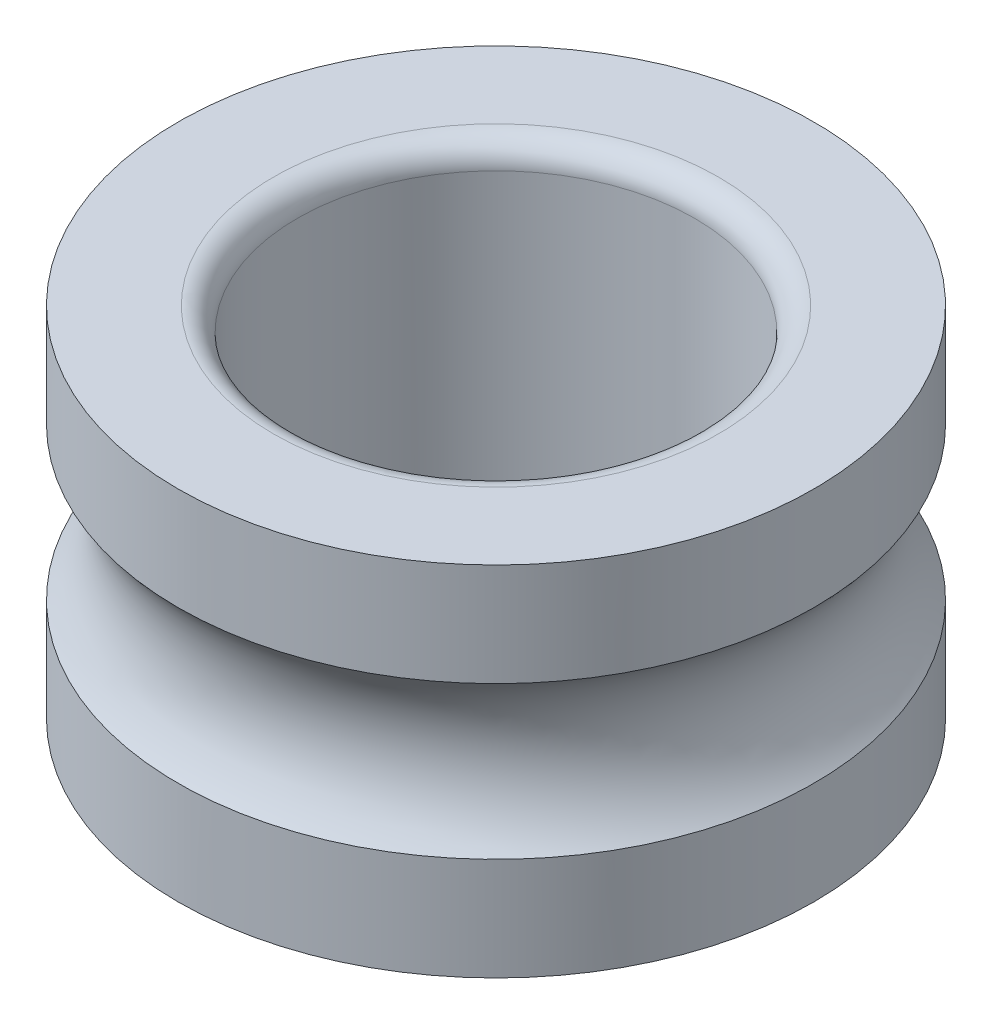
ISO-10303-21;
HEADER;
FILE_DESCRIPTION(('STEP AP214'),'2;1');
FILE_NAME('part.step','',(''),(''),'','','');
FILE_SCHEMA(('AUTOMOTIVE_DESIGN { 1 0 10303 214 1 1 1 1 }'));
ENDSEC;
DATA;
#1=APPLICATION_CONTEXT('core data for automotive mechanical design processes');
#2=APPLICATION_PROTOCOL_DEFINITION('international standard','automotive_design',2000,#1);
#3=PRODUCT_CONTEXT('',#1,'mechanical');
#4=PRODUCT('Part','Part','',(#3));
#5=PRODUCT_RELATED_PRODUCT_CATEGORY('part','',(#4));
#6=PRODUCT_DEFINITION_FORMATION('','',#4);
#7=PRODUCT_DEFINITION_CONTEXT('part definition',#1,'design');
#8=PRODUCT_DEFINITION('design','',#6,#7);
#9=PRODUCT_DEFINITION_SHAPE('','',#8);
#10=(LENGTH_UNIT() NAMED_UNIT(*) SI_UNIT(.MILLI.,.METRE.));
#11=(NAMED_UNIT(*) PLANE_ANGLE_UNIT() SI_UNIT($,.RADIAN.));
#12=(NAMED_UNIT(*) SI_UNIT($,.STERADIAN.) SOLID_ANGLE_UNIT());
#13=UNCERTAINTY_MEASURE_WITH_UNIT(LENGTH_MEASURE(1.E-05),#10,'distance_accuracy_value','');
#14=(GEOMETRIC_REPRESENTATION_CONTEXT(3) GLOBAL_UNCERTAINTY_ASSIGNED_CONTEXT((#13)) GLOBAL_UNIT_ASSIGNED_CONTEXT((#10,
#11,#12)) REPRESENTATION_CONTEXT('',''));
#15=CARTESIAN_POINT('',(0.,0.,0.));
#16=DIRECTION('',(0.,0.,1.));
#17=DIRECTION('',(1.,0.,0.));
#18=AXIS2_PLACEMENT_3D('',#15,#16,#17);
#19=CARTESIAN_POINT('',(0.,-3.9,0.));
#20=DIRECTION('',(0.,1.,0.));
#21=DIRECTION('',(0.,0.,-1.));
#22=AXIS2_PLACEMENT_3D('',#19,#20,#21);
#23=TOROIDAL_SURFACE('',#22,5.6,0.6);
#24=CARTESIAN_POINT('',(0.,-3.9,0.));
#25=DIRECTION('',(0.,-1.,0.));
#26=DIRECTION('',(0.,0.,-1.));
#27=AXIS2_PLACEMENT_3D('',#24,#25,#26);
#28=CIRCLE('',#27,5.);
#29=CARTESIAN_POINT('',(0.,-3.9,5.));
#30=VERTEX_POINT('',#29);
#31=EDGE_CURVE('E11',#30,#30,#28,.T.);
#32=ORIENTED_EDGE('',*,*,#31,.F.);
#33=EDGE_LOOP('',(#32));
#34=FACE_BOUND('',#33,.T.);
#35=CARTESIAN_POINT('',(0.,-4.5,0.));
#36=DIRECTION('',(0.,1.,0.));
#37=DIRECTION('',(0.,0.,-1.));
#38=AXIS2_PLACEMENT_3D('',#35,#36,#37);
#39=CIRCLE('',#38,5.6);
#40=CARTESIAN_POINT('',(0.,-4.5,-5.6));
#41=VERTEX_POINT('',#40);
#42=EDGE_CURVE('E46',#41,#41,#39,.T.);
#43=ORIENTED_EDGE('',*,*,#42,.F.);
#44=EDGE_LOOP('',(#43));
#45=FACE_BOUND('',#44,.T.);
#46=ADVANCED_FACE('F17',(#34,#45),#23,.T.);
#47=CARTESIAN_POINT('',(0.,-4.95,0.));
#48=DIRECTION('',(0.,1.,0.));
#49=DIRECTION('',(0.,0.,-1.));
#50=AXIS2_PLACEMENT_3D('',#47,#48,#49);
#51=CYLINDRICAL_SURFACE('',#50,5.);
#52=ORIENTED_EDGE('',*,*,#31,.T.);
#53=EDGE_LOOP('',(#52));
#54=FACE_BOUND('',#53,.T.);
#55=CARTESIAN_POINT('',(0.,3.9,0.));
#56=DIRECTION('',(0.,-1.,0.));
#57=DIRECTION('',(0.,0.,-1.));
#58=AXIS2_PLACEMENT_3D('',#55,#56,#57);
#59=CIRCLE('',#58,5.);
#60=CARTESIAN_POINT('',(0.,3.9,-5.));
#61=VERTEX_POINT('',#60);
#62=EDGE_CURVE('E27',#61,#61,#59,.T.);
#63=ORIENTED_EDGE('',*,*,#62,.F.);
#64=EDGE_LOOP('',(#63));
#65=FACE_BOUND('',#64,.T.);
#66=ADVANCED_FACE('F111',(#54,#65),#51,.F.);
#67=CARTESIAN_POINT('',(0.,3.9,0.));
#68=DIRECTION('',(0.,1.,0.));
#69=DIRECTION('',(0.,0.,-1.));
#70=AXIS2_PLACEMENT_3D('',#67,#68,#69);
#71=TOROIDAL_SURFACE('',#70,5.6,0.6);
#72=CARTESIAN_POINT('',(0.,4.5,0.));
#73=DIRECTION('',(0.,-1.,0.));
#74=DIRECTION('',(0.,0.,-1.));
#75=AXIS2_PLACEMENT_3D('',#72,#73,#74);
#76=CIRCLE('',#75,5.6);
#77=CARTESIAN_POINT('',(0.,4.5,5.6));
#78=VERTEX_POINT('',#77);
#79=EDGE_CURVE('E85',#78,#78,#76,.T.);
#80=ORIENTED_EDGE('',*,*,#79,.F.);
#81=EDGE_LOOP('',(#80));
#82=FACE_BOUND('',#81,.T.);
#83=ORIENTED_EDGE('',*,*,#62,.T.);
#84=EDGE_LOOP('',(#83));
#85=FACE_BOUND('',#84,.T.);
#86=ADVANCED_FACE('F106',(#82,#85),#71,.T.);
#87=CARTESIAN_POINT('',(0.,4.5,0.));
#88=DIRECTION('',(0.,1.,0.));
#89=DIRECTION('',(1.,0.,0.));
#90=AXIS2_PLACEMENT_3D('',#87,#88,#89);
#91=PLANE('',#90);
#92=CARTESIAN_POINT('',(0.,4.5,0.));
#93=DIRECTION('',(0.,1.,0.));
#94=DIRECTION('',(0.,0.,-1.));
#95=AXIS2_PLACEMENT_3D('',#92,#93,#94);
#96=CIRCLE('',#95,8.);
#97=CARTESIAN_POINT('',(0.,4.5,8.));
#98=VERTEX_POINT('',#97);
#99=EDGE_CURVE('E89',#98,#98,#96,.T.);
#100=ORIENTED_EDGE('',*,*,#99,.T.);
#101=EDGE_LOOP('',(#100));
#102=FACE_BOUND('',#101,.T.);
#103=ORIENTED_EDGE('',*,*,#79,.T.);
#104=EDGE_LOOP('',(#103));
#105=FACE_BOUND('',#104,.T.);
#106=ADVANCED_FACE('F101',(#102,#105),#91,.T.);
#107=CARTESIAN_POINT('',(0.,-4.95,0.));
#108=DIRECTION('',(0.,1.,0.));
#109=DIRECTION('',(0.,0.,-1.));
#110=AXIS2_PLACEMENT_3D('',#107,#108,#109);
#111=CYLINDRICAL_SURFACE('',#110,8.);
#112=CARTESIAN_POINT('',(0.,1.914449006895,0.));
#113=DIRECTION('',(0.,-1.,0.));
#114=DIRECTION('',(0.,0.,-1.));
#115=AXIS2_PLACEMENT_3D('',#112,#113,#114);
#116=CIRCLE('',#115,8.);
#117=CARTESIAN_POINT('',(0.,1.914449006895,8.));
#118=VERTEX_POINT('',#117);
#119=EDGE_CURVE('E81',#118,#118,#116,.T.);
#120=ORIENTED_EDGE('',*,*,#119,.F.);
#121=EDGE_LOOP('',(#120));
#122=FACE_BOUND('',#121,.T.);
#123=ORIENTED_EDGE('',*,*,#99,.F.);
#124=EDGE_LOOP('',(#123));
#125=FACE_BOUND('',#124,.T.);
#126=ADVANCED_FACE('F98',(#122,#125),#111,.T.);
#127=CARTESIAN_POINT('',(0.,0.,0.));
#128=DIRECTION('',(0.,1.,0.));
#129=DIRECTION('',(0.,0.,-1.));
#130=AXIS2_PLACEMENT_3D('',#127,#128,#129);
#131=TOROIDAL_SURFACE('',#130,10.013,2.778);
#132=ORIENTED_EDGE('',*,*,#119,.T.);
#133=EDGE_LOOP('',(#132));
#134=FACE_BOUND('',#133,.T.);
#135=CARTESIAN_POINT('',(0.,-1.914449006895,0.));
#136=DIRECTION('',(0.,-1.,0.));
#137=DIRECTION('',(0.,0.,-1.));
#138=AXIS2_PLACEMENT_3D('',#135,#136,#137);
#139=CIRCLE('',#138,8.);
#140=CARTESIAN_POINT('',(0.,-1.914449006895,-8.));
#141=VERTEX_POINT('',#140);
#142=EDGE_CURVE('E21',#141,#141,#139,.T.);
#143=ORIENTED_EDGE('',*,*,#142,.F.);
#144=EDGE_LOOP('',(#143));
#145=FACE_BOUND('',#144,.T.);
#146=ADVANCED_FACE('F19',(#134,#145),#131,.F.);
#147=CARTESIAN_POINT('',(0.,-4.95,0.));
#148=DIRECTION('',(0.,1.,0.));
#149=DIRECTION('',(0.,0.,-1.));
#150=AXIS2_PLACEMENT_3D('',#147,#148,#149);
#151=CYLINDRICAL_SURFACE('',#150,8.);
#152=CARTESIAN_POINT('',(0.,-4.5,0.));
#153=DIRECTION('',(0.,-1.,0.));
#154=DIRECTION('',(0.,0.,-1.));
#155=AXIS2_PLACEMENT_3D('',#152,#153,#154);
#156=CIRCLE('',#155,8.);
#157=CARTESIAN_POINT('',(0.,-4.5,8.));
#158=VERTEX_POINT('',#157);
#159=EDGE_CURVE('E72',#158,#158,#156,.T.);
#160=ORIENTED_EDGE('',*,*,#159,.F.);
#161=EDGE_LOOP('',(#160));
#162=FACE_BOUND('',#161,.T.);
#163=ORIENTED_EDGE('',*,*,#142,.T.);
#164=EDGE_LOOP('',(#163));
#165=FACE_BOUND('',#164,.T.);
#166=ADVANCED_FACE('F73',(#162,#165),#151,.T.);
#167=CARTESIAN_POINT('',(0.,-4.5,0.));
#168=DIRECTION('',(0.,1.,0.));
#169=DIRECTION('',(1.,0.,0.));
#170=AXIS2_PLACEMENT_3D('',#167,#168,#169);
#171=PLANE('',#170);
#172=ORIENTED_EDGE('',*,*,#159,.T.);
#173=EDGE_LOOP('',(#172));
#174=FACE_BOUND('',#173,.T.);
#175=ORIENTED_EDGE('',*,*,#42,.T.);
#176=EDGE_LOOP('',(#175));
#177=FACE_BOUND('',#176,.T.);
#178=ADVANCED_FACE('F126',(#174,#177),#171,.F.);
#179=CLOSED_SHELL('',(#46,#66,#86,#106,#126,#146,#166,#178));
#180=MANIFOLD_SOLID_BREP('B1',#179);
#181=ADVANCED_BREP_SHAPE_REPRESENTATION('',(#18,#180),#14);
#182=SHAPE_DEFINITION_REPRESENTATION(#9,#181);
ENDSEC;
END-ISO-10303-21;
